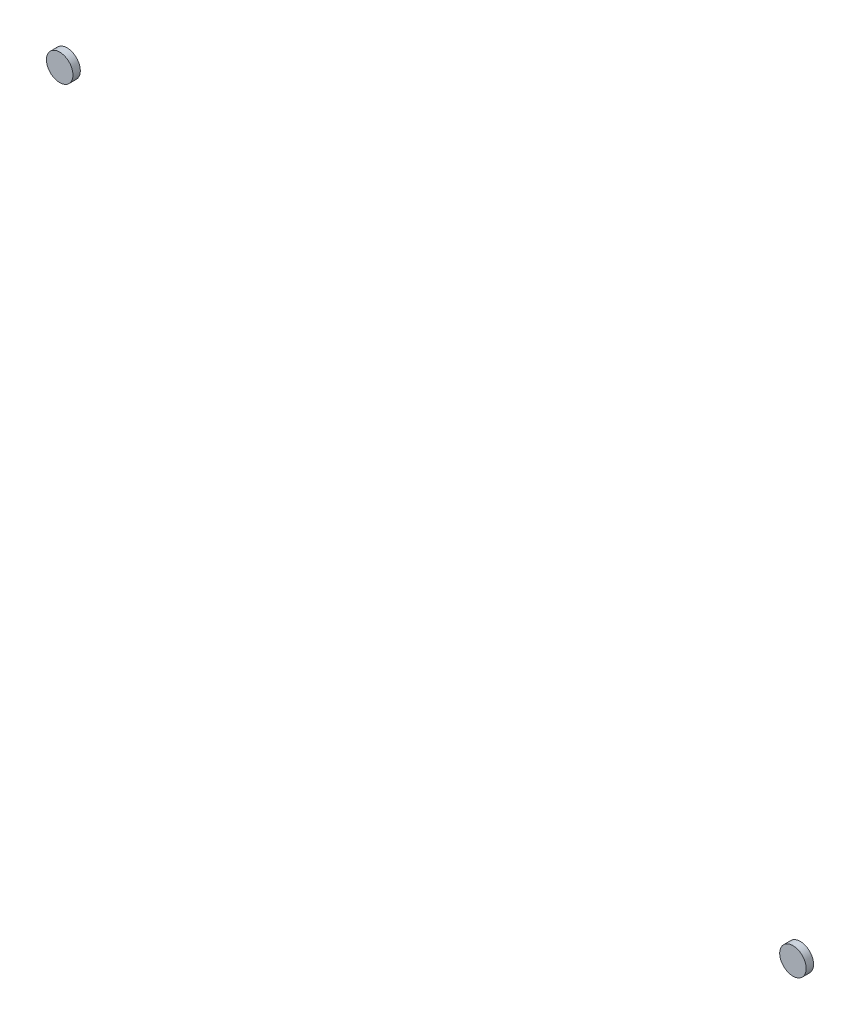
ISO-10303-21;
HEADER;
FILE_DESCRIPTION(('STEP AP214'),'2;1');
FILE_NAME('part.step','',(''),(''),'','','');
FILE_SCHEMA(('AUTOMOTIVE_DESIGN { 1 0 10303 214 1 1 1 1 }'));
ENDSEC;
DATA;
#1=APPLICATION_CONTEXT('core data for automotive mechanical design processes');
#2=APPLICATION_PROTOCOL_DEFINITION('international standard','automotive_design',2000,#1);
#3=PRODUCT_CONTEXT('',#1,'mechanical');
#4=PRODUCT('Part','Part','',(#3));
#5=PRODUCT_RELATED_PRODUCT_CATEGORY('part','',(#4));
#6=PRODUCT_DEFINITION_FORMATION('','',#4);
#7=PRODUCT_DEFINITION_CONTEXT('part definition',#1,'design');
#8=PRODUCT_DEFINITION('design','',#6,#7);
#9=PRODUCT_DEFINITION_SHAPE('','',#8);
#10=(LENGTH_UNIT() NAMED_UNIT(*) SI_UNIT(.MILLI.,.METRE.));
#11=(NAMED_UNIT(*) PLANE_ANGLE_UNIT() SI_UNIT($,.RADIAN.));
#12=(NAMED_UNIT(*) SI_UNIT($,.STERADIAN.) SOLID_ANGLE_UNIT());
#13=UNCERTAINTY_MEASURE_WITH_UNIT(LENGTH_MEASURE(1.E-05),#10,'distance_accuracy_value','');
#14=(GEOMETRIC_REPRESENTATION_CONTEXT(3) GLOBAL_UNCERTAINTY_ASSIGNED_CONTEXT((#13)) GLOBAL_UNIT_ASSIGNED_CONTEXT((#10,
#11,#12)) REPRESENTATION_CONTEXT('',''));
#15=CARTESIAN_POINT('',(0.,0.,0.));
#16=DIRECTION('',(0.,0.,1.));
#17=DIRECTION('',(1.,0.,0.));
#18=AXIS2_PLACEMENT_3D('',#15,#16,#17);
#19=CARTESIAN_POINT('',(-7.78500549300257,9.83097080651196,-0.253998963258981));
#20=DIRECTION('',(0.,-8.74227339409092E-08,1.));
#21=DIRECTION('',(1.,-8.74227765734792E-08,0.));
#22=AXIS2_PLACEMENT_3D('',#19,#20,#21);
#23=PLANE('',#22);
#24=CARTESIAN_POINT('',(-7.32780549300258,9.83097076654227,-0.253998963258985));
#25=DIRECTION('',(0.,8.74227339409092E-08,-1.));
#26=DIRECTION('',(-1.,8.74227765734792E-08,0.));
#27=AXIS2_PLACEMENT_3D('',#24,#25,#26);
#28=CIRCLE('',#27,0.4572);
#29=CARTESIAN_POINT('',(-7.78500549300258,9.83097080651196,-0.253998963258982));
#30=VERTEX_POINT('',#29);
#31=EDGE_CURVE('P0_E10',#30,#30,#28,.T.);
#32=ORIENTED_EDGE('',*,*,#31,.T.);
#33=EDGE_LOOP('',(#32));
#34=FACE_BOUND('',#33,.T.);
#35=ADVANCED_FACE('P0_F15',(#34),#23,.F.);
#36=CARTESIAN_POINT('',(-7.78500549300257,9.83097078430659,1.0367410172539E-06));
#37=DIRECTION('',(0.,-8.74227339409092E-08,1.));
#38=DIRECTION('',(1.,-8.74227765734792E-08,0.));
#39=AXIS2_PLACEMENT_3D('',#36,#37,#38);
#40=PLANE('',#39);
#41=CARTESIAN_POINT('',(-7.32780549300258,9.83097074433689,1.03674101378445E-06));
#42=DIRECTION('',(0.,8.74227339409092E-08,-1.));
#43=DIRECTION('',(-1.,8.74227765734792E-08,0.));
#44=AXIS2_PLACEMENT_3D('',#41,#42,#43);
#45=CIRCLE('',#44,0.4572);
#46=CARTESIAN_POINT('',(-7.78500549300258,9.83097078430658,1.03674101727871E-06));
#47=VERTEX_POINT('',#46);
#48=EDGE_CURVE('P0_E22',#47,#47,#45,.T.);
#49=ORIENTED_EDGE('',*,*,#48,.F.);
#50=EDGE_LOOP('',(#49));
#51=FACE_BOUND('',#50,.T.);
#52=ADVANCED_FACE('P0_F35',(#51),#40,.T.);
#53=CARTESIAN_POINT('',(-7.32780549300258,9.83097074433689,1.03674101378445E-06));
#54=DIRECTION('',(0.,-8.74227339409092E-08,1.));
#55=DIRECTION('',(-1.,8.74227765734792E-08,0.));
#56=AXIS2_PLACEMENT_3D('',#53,#54,#55);
#57=CYLINDRICAL_SURFACE('',#56,0.4572);
#58=ORIENTED_EDGE('',*,*,#31,.F.);
#59=EDGE_LOOP('',(#58));
#60=FACE_BOUND('',#59,.T.);
#61=ORIENTED_EDGE('',*,*,#48,.T.);
#62=EDGE_LOOP('',(#61));
#63=FACE_BOUND('',#62,.T.);
#64=ADVANCED_FACE('P0_F33',(#60,#63),#57,.T.);
#65=CLOSED_SHELL('',(#35,#52,#64));
#66=MANIFOLD_SOLID_BREP('P0_B1',#65);
#67=CARTESIAN_POINT('',(17.9722051935997,-3.76183228521738,-0.253998923289316));
#68=DIRECTION('',(0.,-8.74227339409095E-08,1.));
#69=DIRECTION('',(-1.19248806384999E-08,-1.,-8.74227339409095E-08));
#70=AXIS2_PLACEMENT_3D('',#67,#68,#69);
#71=PLANE('',#70);
#72=CARTESIAN_POINT('',(17.9722051881477,-4.21903228521738,-0.253998963258991));
#73=DIRECTION('',(0.,8.74227339409095E-08,-1.));
#74=DIRECTION('',(1.19248806384999E-08,1.,8.74227339409095E-08));
#75=AXIS2_PLACEMENT_3D('',#72,#73,#74);
#76=CIRCLE('',#75,0.4572);
#77=CARTESIAN_POINT('',(17.9722051935998,-3.76183228521738,-0.253998923289317));
#78=VERTEX_POINT('',#77);
#79=EDGE_CURVE('P1_E10',#78,#78,#76,.T.);
#80=ORIENTED_EDGE('',*,*,#79,.T.);
#81=EDGE_LOOP('',(#80));
#82=FACE_BOUND('',#81,.T.);
#83=ADVANCED_FACE('P1_F15',(#82),#71,.F.);
#84=CARTESIAN_POINT('',(17.9722051935997,-3.76183230742275,1.07671068285201E-06));
#85=DIRECTION('',(0.,-8.74227339409095E-08,1.));
#86=DIRECTION('',(-1.19248806384999E-08,-1.,-8.74227339409095E-08));
#87=AXIS2_PLACEMENT_3D('',#84,#85,#86);
#88=PLANE('',#87);
#89=CARTESIAN_POINT('',(17.9722051881477,-4.21903230742275,1.03674100901396E-06));
#90=DIRECTION('',(0.,8.74227339409095E-08,-1.));
#91=DIRECTION('',(1.19248806384999E-08,1.,8.74227339409095E-08));
#92=AXIS2_PLACEMENT_3D('',#89,#90,#91);
#93=CIRCLE('',#92,0.4572);
#94=CARTESIAN_POINT('',(17.9722051935998,-3.76183230742275,1.07671068297175E-06));
#95=VERTEX_POINT('',#94);
#96=EDGE_CURVE('P1_E22',#95,#95,#93,.T.);
#97=ORIENTED_EDGE('',*,*,#96,.F.);
#98=EDGE_LOOP('',(#97));
#99=FACE_BOUND('',#98,.T.);
#100=ADVANCED_FACE('P1_F35',(#99),#88,.T.);
#101=CARTESIAN_POINT('',(17.9722051881477,-4.21903230742275,1.03674100901396E-06));
#102=DIRECTION('',(0.,-8.74227339409095E-08,1.));
#103=DIRECTION('',(1.19248806384999E-08,1.,8.74227339409095E-08));
#104=AXIS2_PLACEMENT_3D('',#101,#102,#103);
#105=CYLINDRICAL_SURFACE('',#104,0.4572);
#106=ORIENTED_EDGE('',*,*,#79,.F.);
#107=EDGE_LOOP('',(#106));
#108=FACE_BOUND('',#107,.T.);
#109=ORIENTED_EDGE('',*,*,#96,.T.);
#110=EDGE_LOOP('',(#109));
#111=FACE_BOUND('',#110,.T.);
#112=ADVANCED_FACE('P1_F33',(#108,#111),#105,.T.);
#113=CLOSED_SHELL('',(#83,#100,#112));
#114=MANIFOLD_SOLID_BREP('P1_B1',#113);
#115=ADVANCED_BREP_SHAPE_REPRESENTATION('',(#18,#66,#114),#14);
#116=SHAPE_DEFINITION_REPRESENTATION(#9,#115);
ENDSEC;
END-ISO-10303-21;
